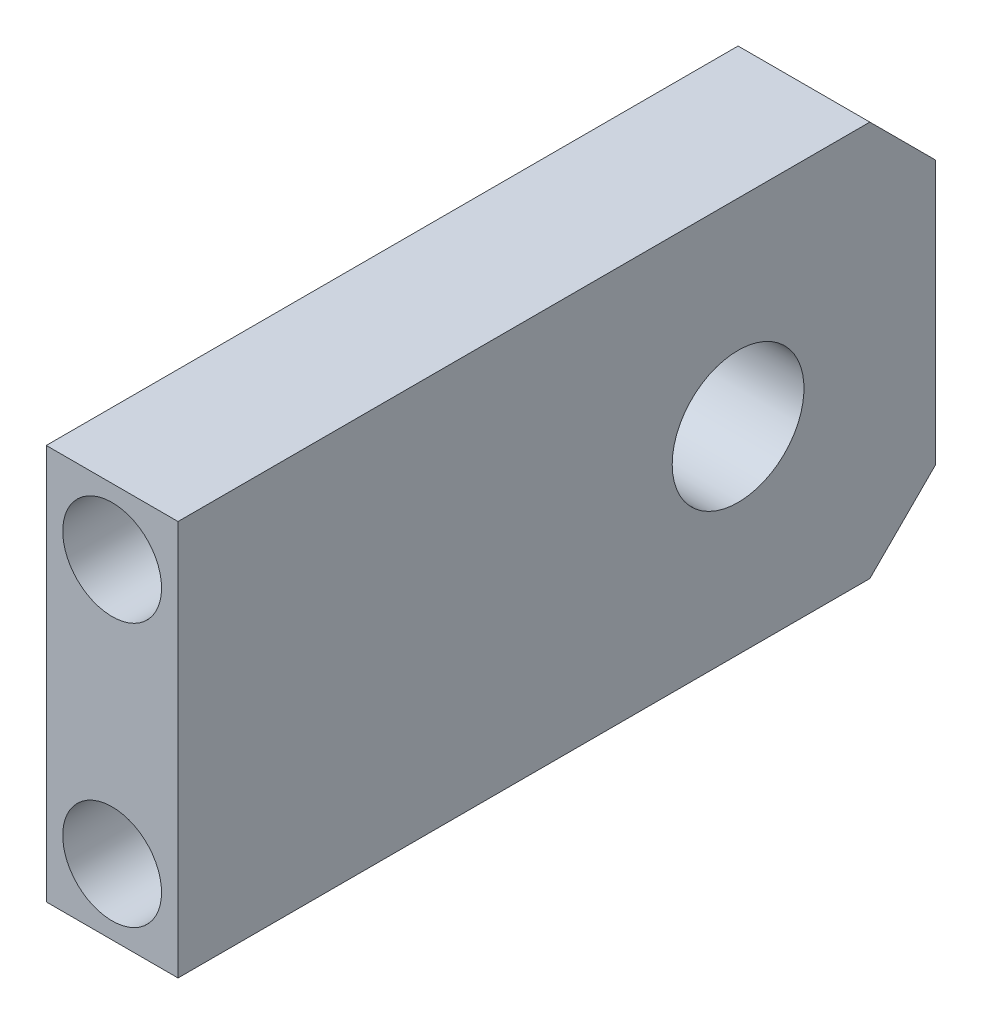
ISO-10303-21;
HEADER;
FILE_DESCRIPTION(('STEP AP214'),'2;1');
FILE_NAME('part.step','',(''),(''),'','','');
FILE_SCHEMA(('AUTOMOTIVE_DESIGN { 1 0 10303 214 1 1 1 1 }'));
ENDSEC;
DATA;
#1=APPLICATION_CONTEXT('core data for automotive mechanical design processes');
#2=APPLICATION_PROTOCOL_DEFINITION('international standard','automotive_design',2000,#1);
#3=PRODUCT_CONTEXT('',#1,'mechanical');
#4=PRODUCT('Part','Part','',(#3));
#5=PRODUCT_RELATED_PRODUCT_CATEGORY('part','',(#4));
#6=PRODUCT_DEFINITION_FORMATION('','',#4);
#7=PRODUCT_DEFINITION_CONTEXT('part definition',#1,'design');
#8=PRODUCT_DEFINITION('design','',#6,#7);
#9=PRODUCT_DEFINITION_SHAPE('','',#8);
#10=(LENGTH_UNIT() NAMED_UNIT(*) SI_UNIT(.MILLI.,.METRE.));
#11=(NAMED_UNIT(*) PLANE_ANGLE_UNIT() SI_UNIT($,.RADIAN.));
#12=(NAMED_UNIT(*) SI_UNIT($,.STERADIAN.) SOLID_ANGLE_UNIT());
#13=UNCERTAINTY_MEASURE_WITH_UNIT(LENGTH_MEASURE(1.E-05),#10,'distance_accuracy_value','');
#14=(GEOMETRIC_REPRESENTATION_CONTEXT(3) GLOBAL_UNCERTAINTY_ASSIGNED_CONTEXT((#13)) GLOBAL_UNIT_ASSIGNED_CONTEXT((#10,
#11,#12)) REPRESENTATION_CONTEXT('',''));
#15=CARTESIAN_POINT('',(0.,0.,0.));
#16=DIRECTION('',(0.,0.,1.));
#17=DIRECTION('',(1.,0.,0.));
#18=AXIS2_PLACEMENT_3D('',#15,#16,#17);
#19=CARTESIAN_POINT('',(4.,0.,0.));
#20=DIRECTION('',(0.,0.,-1.));
#21=DIRECTION('',(0.,1.,0.));
#22=AXIS2_PLACEMENT_3D('',#19,#20,#21);
#23=PLANE('',#22);
#24=CARTESIAN_POINT('',(2.,-2.,0.));
#25=DIRECTION('',(0.,0.,1.));
#26=DIRECTION('',(1.,0.,0.));
#27=AXIS2_PLACEMENT_3D('',#24,#25,#26);
#28=CIRCLE('',#27,1.5);
#29=CARTESIAN_POINT('',(3.5,-2.,0.));
#30=VERTEX_POINT('',#29);
#31=EDGE_CURVE('E213',#30,#30,#28,.T.);
#32=ORIENTED_EDGE('',*,*,#31,.F.);
#33=EDGE_LOOP('',(#32));
#34=FACE_BOUND('',#33,.T.);
#35=CARTESIAN_POINT('',(2.,-10.,0.));
#36=DIRECTION('',(0.,0.,1.));
#37=DIRECTION('',(1.,0.,0.));
#38=AXIS2_PLACEMENT_3D('',#35,#36,#37);
#39=CIRCLE('',#38,1.5);
#40=CARTESIAN_POINT('',(3.5,-10.,0.));
#41=VERTEX_POINT('',#40);
#42=EDGE_CURVE('E208',#41,#41,#39,.T.);
#43=ORIENTED_EDGE('',*,*,#42,.F.);
#44=EDGE_LOOP('',(#43));
#45=FACE_BOUND('',#44,.T.);
#46=DIRECTION('',(0.,-1.,0.));
#47=VECTOR('',#46,1.);
#48=CARTESIAN_POINT('',(0.,0.,0.));
#49=LINE('',#48,#47);
#50=CARTESIAN_POINT('',(0.,0.,0.));
#51=VERTEX_POINT('',#50);
#52=CARTESIAN_POINT('',(0.,-12.,0.));
#53=VERTEX_POINT('',#52);
#54=EDGE_CURVE('E109',#51,#53,#49,.T.);
#55=ORIENTED_EDGE('',*,*,#54,.T.);
#56=DIRECTION('',(-1.,0.,0.));
#57=VECTOR('',#56,1.);
#58=CARTESIAN_POINT('',(4.,-12.,0.));
#59=LINE('',#58,#57);
#60=CARTESIAN_POINT('',(4.,-12.,0.));
#61=VERTEX_POINT('',#60);
#62=EDGE_CURVE('E96',#61,#53,#59,.T.);
#63=ORIENTED_EDGE('',*,*,#62,.F.);
#64=DIRECTION('',(0.,-1.,0.));
#65=VECTOR('',#64,1.);
#66=CARTESIAN_POINT('',(4.,0.,0.));
#67=LINE('',#66,#65);
#68=CARTESIAN_POINT('',(4.,0.,0.));
#69=VERTEX_POINT('',#68);
#70=EDGE_CURVE('E100',#69,#61,#67,.T.);
#71=ORIENTED_EDGE('',*,*,#70,.F.);
#72=DIRECTION('',(-1.,0.,0.));
#73=VECTOR('',#72,1.);
#74=CARTESIAN_POINT('',(4.,0.,0.));
#75=LINE('',#74,#73);
#76=EDGE_CURVE('E111',#69,#51,#75,.T.);
#77=ORIENTED_EDGE('',*,*,#76,.T.);
#78=EDGE_LOOP('',(#55,#63,#71,#77));
#79=FACE_BOUND('',#78,.T.);
#80=ADVANCED_FACE('F37',(#34,#45,#79),#23,.F.);
#81=CARTESIAN_POINT('',(4.,-12.,0.));
#82=DIRECTION('',(0.,1.,0.));
#83=DIRECTION('',(0.,0.,1.));
#84=AXIS2_PLACEMENT_3D('',#81,#82,#83);
#85=PLANE('',#84);
#86=DIRECTION('',(0.,0.,-1.));
#87=VECTOR('',#86,1.);
#88=CARTESIAN_POINT('',(0.,-12.,0.));
#89=LINE('',#88,#87);
#90=CARTESIAN_POINT('',(0.,-12.,-21.));
#91=VERTEX_POINT('',#90);
#92=EDGE_CURVE('E137',#53,#91,#89,.T.);
#93=ORIENTED_EDGE('',*,*,#92,.T.);
#94=DIRECTION('',(1.,0.,0.));
#95=VECTOR('',#94,1.);
#96=CARTESIAN_POINT('',(4.,-12.,-21.));
#97=LINE('',#96,#95);
#98=CARTESIAN_POINT('',(4.,-12.,-21.));
#99=VERTEX_POINT('',#98);
#100=EDGE_CURVE('E61',#91,#99,#97,.T.);
#101=ORIENTED_EDGE('',*,*,#100,.T.);
#102=DIRECTION('',(0.,0.,-1.));
#103=VECTOR('',#102,1.);
#104=CARTESIAN_POINT('',(4.,-12.,0.));
#105=LINE('',#104,#103);
#106=EDGE_CURVE('E92',#61,#99,#105,.T.);
#107=ORIENTED_EDGE('',*,*,#106,.F.);
#108=ORIENTED_EDGE('',*,*,#62,.T.);
#109=EDGE_LOOP('',(#93,#101,#107,#108));
#110=FACE_BOUND('',#109,.T.);
#111=ADVANCED_FACE('F94',(#110),#85,.F.);
#112=CARTESIAN_POINT('',(4.,0.,-23.));
#113=DIRECTION('',(0.,0.,-1.));
#114=DIRECTION('',(-1.,0.,0.));
#115=AXIS2_PLACEMENT_3D('',#112,#113,#114);
#116=PLANE('',#115);
#117=DIRECTION('',(0.,-1.,0.));
#118=VECTOR('',#117,1.);
#119=CARTESIAN_POINT('',(4.,0.,-23.));
#120=LINE('',#119,#118);
#121=CARTESIAN_POINT('',(4.,-2.00000000000001,-23.));
#122=VERTEX_POINT('',#121);
#123=CARTESIAN_POINT('',(4.,-9.99999999999999,-23.));
#124=VERTEX_POINT('',#123);
#125=EDGE_CURVE('E99',#122,#124,#120,.T.);
#126=ORIENTED_EDGE('',*,*,#125,.T.);
#127=DIRECTION('',(-1.,0.,0.));
#128=VECTOR('',#127,1.);
#129=CARTESIAN_POINT('',(0.,-9.99999999999999,-23.));
#130=LINE('',#129,#128);
#131=CARTESIAN_POINT('',(0.,-9.99999999999999,-23.));
#132=VERTEX_POINT('',#131);
#133=EDGE_CURVE('E113',#124,#132,#130,.T.);
#134=ORIENTED_EDGE('',*,*,#133,.T.);
#135=DIRECTION('',(0.,-1.,0.));
#136=VECTOR('',#135,1.);
#137=CARTESIAN_POINT('',(0.,0.,-23.));
#138=LINE('',#137,#136);
#139=CARTESIAN_POINT('',(0.,-2.00000000000001,-23.));
#140=VERTEX_POINT('',#139);
#141=EDGE_CURVE('E138',#140,#132,#138,.T.);
#142=ORIENTED_EDGE('',*,*,#141,.F.);
#143=DIRECTION('',(1.,0.,0.));
#144=VECTOR('',#143,1.);
#145=CARTESIAN_POINT('',(4.,-2.00000000000001,-23.));
#146=LINE('',#145,#144);
#147=EDGE_CURVE('E110',#140,#122,#146,.T.);
#148=ORIENTED_EDGE('',*,*,#147,.T.);
#149=EDGE_LOOP('',(#126,#134,#142,#148));
#150=FACE_BOUND('',#149,.T.);
#151=ADVANCED_FACE('F129',(#150),#116,.T.);
#152=CARTESIAN_POINT('',(4.,0.,0.));
#153=DIRECTION('',(0.,1.,0.));
#154=DIRECTION('',(0.,0.,1.));
#155=AXIS2_PLACEMENT_3D('',#152,#153,#154);
#156=PLANE('',#155);
#157=DIRECTION('',(0.,0.,-1.));
#158=VECTOR('',#157,1.);
#159=CARTESIAN_POINT('',(4.,0.,0.));
#160=LINE('',#159,#158);
#161=CARTESIAN_POINT('',(4.,0.,-21.));
#162=VERTEX_POINT('',#161);
#163=EDGE_CURVE('E104',#69,#162,#160,.T.);
#164=ORIENTED_EDGE('',*,*,#163,.T.);
#165=DIRECTION('',(-1.,0.,0.));
#166=VECTOR('',#165,1.);
#167=CARTESIAN_POINT('',(4.,0.,-21.));
#168=LINE('',#167,#166);
#169=CARTESIAN_POINT('',(0.,0.,-21.));
#170=VERTEX_POINT('',#169);
#171=EDGE_CURVE('E11',#162,#170,#168,.T.);
#172=ORIENTED_EDGE('',*,*,#171,.T.);
#173=DIRECTION('',(0.,0.,-1.));
#174=VECTOR('',#173,1.);
#175=CARTESIAN_POINT('',(0.,0.,0.));
#176=LINE('',#175,#174);
#177=EDGE_CURVE('E106',#51,#170,#176,.T.);
#178=ORIENTED_EDGE('',*,*,#177,.F.);
#179=ORIENTED_EDGE('',*,*,#76,.F.);
#180=EDGE_LOOP('',(#164,#172,#178,#179));
#181=FACE_BOUND('',#180,.T.);
#182=ADVANCED_FACE('F147',(#181),#156,.T.);
#183=CARTESIAN_POINT('',(4.,0.,0.));
#184=DIRECTION('',(1.,0.,0.));
#185=DIRECTION('',(0.,0.,-1.));
#186=AXIS2_PLACEMENT_3D('',#183,#184,#185);
#187=PLANE('',#186);
#188=CARTESIAN_POINT('',(4.,-6.,-17.));
#189=DIRECTION('',(-1.,0.,0.));
#190=DIRECTION('',(0.,0.,1.));
#191=AXIS2_PLACEMENT_3D('',#188,#189,#190);
#192=CIRCLE('',#191,2.);
#193=CARTESIAN_POINT('',(4.,-6.,-15.));
#194=VERTEX_POINT('',#193);
#195=EDGE_CURVE('E203',#194,#194,#192,.T.);
#196=ORIENTED_EDGE('',*,*,#195,.T.);
#197=EDGE_LOOP('',(#196));
#198=FACE_BOUND('',#197,.T.);
#199=ORIENTED_EDGE('',*,*,#106,.T.);
#200=DIRECTION('',(0.,0.707106781186547,-0.707106781186548));
#201=VECTOR('',#200,1.);
#202=CARTESIAN_POINT('',(4.,-16.5,-16.5));
#203=LINE('',#202,#201);
#204=EDGE_CURVE('E46',#99,#124,#203,.T.);
#205=ORIENTED_EDGE('',*,*,#204,.T.);
#206=ORIENTED_EDGE('',*,*,#125,.F.);
#207=DIRECTION('',(0.,-0.707106781186549,-0.707106781186546));
#208=VECTOR('',#207,1.);
#209=CARTESIAN_POINT('',(4.,10.5,-10.5));
#210=LINE('',#209,#208);
#211=EDGE_CURVE('E53',#122,#162,#210,.F.);
#212=ORIENTED_EDGE('',*,*,#211,.T.);
#213=ORIENTED_EDGE('',*,*,#163,.F.);
#214=ORIENTED_EDGE('',*,*,#70,.T.);
#215=EDGE_LOOP('',(#199,#205,#206,#212,#213,#214));
#216=FACE_BOUND('',#215,.T.);
#217=ADVANCED_FACE('F103',(#198,#216),#187,.T.);
#218=CARTESIAN_POINT('',(0.,0.,0.));
#219=DIRECTION('',(1.,0.,0.));
#220=DIRECTION('',(0.,0.,-1.));
#221=AXIS2_PLACEMENT_3D('',#218,#219,#220);
#222=PLANE('',#221);
#223=CARTESIAN_POINT('',(0.,-6.,-17.));
#224=DIRECTION('',(-1.,0.,0.));
#225=DIRECTION('',(0.,0.,1.));
#226=AXIS2_PLACEMENT_3D('',#223,#224,#225);
#227=CIRCLE('',#226,2.);
#228=CARTESIAN_POINT('',(0.,-6.,-15.));
#229=VERTEX_POINT('',#228);
#230=EDGE_CURVE('E206',#229,#229,#227,.T.);
#231=ORIENTED_EDGE('',*,*,#230,.F.);
#232=EDGE_LOOP('',(#231));
#233=FACE_BOUND('',#232,.T.);
#234=ORIENTED_EDGE('',*,*,#141,.T.);
#235=DIRECTION('',(0.,-0.707106781186547,0.707106781186548));
#236=VECTOR('',#235,1.);
#237=CARTESIAN_POINT('',(0.,-9.99999999999999,-23.));
#238=LINE('',#237,#236);
#239=EDGE_CURVE('E122',#132,#91,#238,.T.);
#240=ORIENTED_EDGE('',*,*,#239,.T.);
#241=ORIENTED_EDGE('',*,*,#92,.F.);
#242=ORIENTED_EDGE('',*,*,#54,.F.);
#243=ORIENTED_EDGE('',*,*,#177,.T.);
#244=DIRECTION('',(0.,0.707106781186549,0.707106781186546));
#245=VECTOR('',#244,1.);
#246=CARTESIAN_POINT('',(0.,0.,-21.));
#247=LINE('',#246,#245);
#248=EDGE_CURVE('E120',#170,#140,#247,.F.);
#249=ORIENTED_EDGE('',*,*,#248,.T.);
#250=EDGE_LOOP('',(#234,#240,#241,#242,#243,#249));
#251=FACE_BOUND('',#250,.T.);
#252=ADVANCED_FACE('F136',(#233,#251),#222,.F.);
#253=CARTESIAN_POINT('',(2.,-10.,-10.));
#254=DIRECTION('',(0.,0.,1.));
#255=DIRECTION('',(1.,0.,0.));
#256=AXIS2_PLACEMENT_3D('',#253,#254,#255);
#257=CYLINDRICAL_SURFACE('',#256,1.5);
#258=CARTESIAN_POINT('',(2.,-10.,-10.));
#259=DIRECTION('',(0.,0.,1.));
#260=DIRECTION('',(1.,0.,0.));
#261=AXIS2_PLACEMENT_3D('',#258,#259,#260);
#262=CIRCLE('',#261,1.5);
#263=CARTESIAN_POINT('',(3.5,-10.,-10.));
#264=VERTEX_POINT('',#263);
#265=EDGE_CURVE('E216',#264,#264,#262,.T.);
#266=ORIENTED_EDGE('',*,*,#265,.F.);
#267=EDGE_LOOP('',(#266));
#268=FACE_BOUND('',#267,.T.);
#269=ORIENTED_EDGE('',*,*,#42,.T.);
#270=EDGE_LOOP('',(#269));
#271=FACE_BOUND('',#270,.T.);
#272=ADVANCED_FACE('F176',(#268,#271),#257,.F.);
#273=CARTESIAN_POINT('',(2.,-10.,-10.));
#274=DIRECTION('',(0.,0.,1.));
#275=DIRECTION('',(1.,0.,0.));
#276=AXIS2_PLACEMENT_3D('',#273,#274,#275);
#277=PLANE('',#276);
#278=ORIENTED_EDGE('',*,*,#265,.T.);
#279=EDGE_LOOP('',(#278));
#280=FACE_BOUND('',#279,.T.);
#281=ADVANCED_FACE('F183',(#280),#277,.T.);
#282=CARTESIAN_POINT('',(2.,-2.,-10.));
#283=DIRECTION('',(0.,0.,1.));
#284=DIRECTION('',(1.,0.,0.));
#285=AXIS2_PLACEMENT_3D('',#282,#283,#284);
#286=CYLINDRICAL_SURFACE('',#285,1.5);
#287=CARTESIAN_POINT('',(2.,-2.,-10.));
#288=DIRECTION('',(0.,0.,1.));
#289=DIRECTION('',(1.,0.,0.));
#290=AXIS2_PLACEMENT_3D('',#287,#288,#289);
#291=CIRCLE('',#290,1.5);
#292=CARTESIAN_POINT('',(3.5,-2.,-10.));
#293=VERTEX_POINT('',#292);
#294=EDGE_CURVE('E141',#293,#293,#291,.T.);
#295=ORIENTED_EDGE('',*,*,#294,.F.);
#296=EDGE_LOOP('',(#295));
#297=FACE_BOUND('',#296,.T.);
#298=ORIENTED_EDGE('',*,*,#31,.T.);
#299=EDGE_LOOP('',(#298));
#300=FACE_BOUND('',#299,.T.);
#301=ADVANCED_FACE('F187',(#297,#300),#286,.F.);
#302=CARTESIAN_POINT('',(2.,-2.,-10.));
#303=DIRECTION('',(0.,0.,1.));
#304=DIRECTION('',(1.,0.,0.));
#305=AXIS2_PLACEMENT_3D('',#302,#303,#304);
#306=PLANE('',#305);
#307=ORIENTED_EDGE('',*,*,#294,.T.);
#308=EDGE_LOOP('',(#307));
#309=FACE_BOUND('',#308,.T.);
#310=ADVANCED_FACE('F191',(#309),#306,.T.);
#311=CARTESIAN_POINT('',(4.,-6.,-17.));
#312=DIRECTION('',(-1.,0.,0.));
#313=DIRECTION('',(0.,0.,1.));
#314=AXIS2_PLACEMENT_3D('',#311,#312,#313);
#315=CYLINDRICAL_SURFACE('',#314,2.);
#316=ORIENTED_EDGE('',*,*,#195,.F.);
#317=EDGE_LOOP('',(#316));
#318=FACE_BOUND('',#317,.T.);
#319=ORIENTED_EDGE('',*,*,#230,.T.);
#320=EDGE_LOOP('',(#319));
#321=FACE_BOUND('',#320,.T.);
#322=ADVANCED_FACE('F154',(#318,#321),#315,.F.);
#323=CARTESIAN_POINT('',(4.,-9.99999999999999,-23.));
#324=DIRECTION('',(0.,-0.707106781186548,-0.707106781186547));
#325=DIRECTION('',(1.,0.,0.));
#326=AXIS2_PLACEMENT_3D('',#323,#324,#325);
#327=PLANE('',#326);
#328=ORIENTED_EDGE('',*,*,#204,.F.);
#329=ORIENTED_EDGE('',*,*,#100,.F.);
#330=ORIENTED_EDGE('',*,*,#239,.F.);
#331=ORIENTED_EDGE('',*,*,#133,.F.);
#332=EDGE_LOOP('',(#328,#329,#330,#331));
#333=FACE_BOUND('',#332,.T.);
#334=ADVANCED_FACE('F134',(#333),#327,.T.);
#335=CARTESIAN_POINT('',(4.,0.,-21.));
#336=DIRECTION('',(0.,-0.707106781186546,0.707106781186549));
#337=DIRECTION('',(-1.,0.,0.));
#338=AXIS2_PLACEMENT_3D('',#335,#336,#337);
#339=PLANE('',#338);
#340=ORIENTED_EDGE('',*,*,#211,.F.);
#341=ORIENTED_EDGE('',*,*,#147,.F.);
#342=ORIENTED_EDGE('',*,*,#248,.F.);
#343=ORIENTED_EDGE('',*,*,#171,.F.);
#344=EDGE_LOOP('',(#340,#341,#342,#343));
#345=FACE_BOUND('',#344,.T.);
#346=ADVANCED_FACE('F40',(#345),#339,.F.);
#347=CLOSED_SHELL('',(#80,#111,#151,#182,#217,#252,#272,#281,#301,#310,#322,#334,#346));
#348=MANIFOLD_SOLID_BREP('B2',#347);
#349=ADVANCED_BREP_SHAPE_REPRESENTATION('',(#18,#348),#14);
#350=SHAPE_DEFINITION_REPRESENTATION(#9,#349);
ENDSEC;
END-ISO-10303-21;
